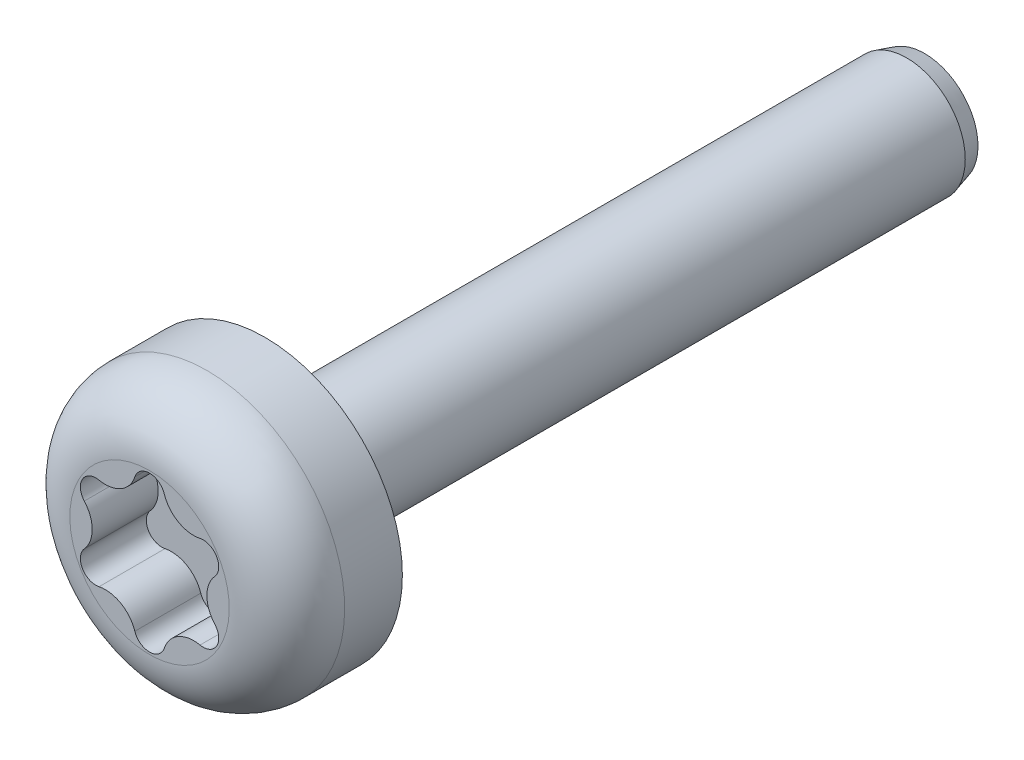
ISO-10303-21;
HEADER;
FILE_DESCRIPTION(('STEP AP214'),'2;1');
FILE_NAME('part.step','',(''),(''),'','','');
FILE_SCHEMA(('AUTOMOTIVE_DESIGN { 1 0 10303 214 1 1 1 1 }'));
ENDSEC;
DATA;
#1=APPLICATION_CONTEXT('core data for automotive mechanical design processes');
#2=APPLICATION_PROTOCOL_DEFINITION('international standard','automotive_design',2000,#1);
#3=PRODUCT_CONTEXT('',#1,'mechanical');
#4=PRODUCT('Part','Part','',(#3));
#5=PRODUCT_RELATED_PRODUCT_CATEGORY('part','',(#4));
#6=PRODUCT_DEFINITION_FORMATION('','',#4);
#7=PRODUCT_DEFINITION_CONTEXT('part definition',#1,'design');
#8=PRODUCT_DEFINITION('design','',#6,#7);
#9=PRODUCT_DEFINITION_SHAPE('','',#8);
#10=(LENGTH_UNIT() NAMED_UNIT(*) SI_UNIT(.MILLI.,.METRE.));
#11=(NAMED_UNIT(*) PLANE_ANGLE_UNIT() SI_UNIT($,.RADIAN.));
#12=(NAMED_UNIT(*) SI_UNIT($,.STERADIAN.) SOLID_ANGLE_UNIT());
#13=UNCERTAINTY_MEASURE_WITH_UNIT(LENGTH_MEASURE(1.E-05),#10,'distance_accuracy_value','');
#14=(GEOMETRIC_REPRESENTATION_CONTEXT(3) GLOBAL_UNCERTAINTY_ASSIGNED_CONTEXT((#13)) GLOBAL_UNIT_ASSIGNED_CONTEXT((#10,
#11,#12)) REPRESENTATION_CONTEXT('',''));
#15=CARTESIAN_POINT('',(0.,0.,0.));
#16=DIRECTION('',(0.,0.,1.));
#17=DIRECTION('',(1.,0.,0.));
#18=AXIS2_PLACEMENT_3D('',#15,#16,#17);
#19=CARTESIAN_POINT('',(0.,0.,-12.));
#20=DIRECTION('',(0.,0.,1.));
#21=DIRECTION('',(1.,0.,0.));
#22=AXIS2_PLACEMENT_3D('',#19,#20,#21);
#23=CYLINDRICAL_SURFACE('',#22,1.065);
#24=CARTESIAN_POINT('',(0.,0.,0.));
#25=DIRECTION('',(0.,0.,1.));
#26=DIRECTION('',(1.,0.,0.));
#27=AXIS2_PLACEMENT_3D('',#24,#25,#26);
#28=CIRCLE('',#27,1.065);
#29=CARTESIAN_POINT('',(1.065,0.,0.));
#30=VERTEX_POINT('',#29);
#31=EDGE_CURVE('E11',#30,#30,#28,.T.);
#32=ORIENTED_EDGE('',*,*,#31,.F.);
#33=EDGE_LOOP('',(#32));
#34=FACE_BOUND('',#33,.T.);
#35=CARTESIAN_POINT('',(0.,0.,-11.6755924170616));
#36=DIRECTION('',(0.,0.,1.));
#37=DIRECTION('',(1.,0.,0.));
#38=AXIS2_PLACEMENT_3D('',#35,#36,#37);
#39=CIRCLE('',#38,1.065);
#40=CARTESIAN_POINT('',(1.065,0.,-11.6755924170616));
#41=VERTEX_POINT('',#40);
#42=EDGE_CURVE('E45',#41,#41,#39,.F.);
#43=ORIENTED_EDGE('',*,*,#42,.F.);
#44=EDGE_LOOP('',(#43));
#45=FACE_BOUND('',#44,.T.);
#46=ADVANCED_FACE('F41',(#34,#45),#23,.T.);
#47=CARTESIAN_POINT('',(0.,1.065,0.));
#48=DIRECTION('',(0.,0.,-1.));
#49=DIRECTION('',(-1.,0.,0.));
#50=AXIS2_PLACEMENT_3D('',#47,#48,#49);
#51=PLANE('',#50);
#52=ORIENTED_EDGE('',*,*,#31,.T.);
#53=EDGE_LOOP('',(#52));
#54=FACE_BOUND('',#53,.T.);
#55=ADVANCED_FACE('F43',(#54),#51,.F.);
#56=CARTESIAN_POINT('',(0.,0.,-10.15));
#57=DIRECTION('',(0.,0.,1.));
#58=DIRECTION('',(1.,0.,0.));
#59=AXIS2_PLACEMENT_3D('',#56,#57,#58);
#60=CONICAL_SURFACE('',#59,1.5,0.277764136028814);
#61=CARTESIAN_POINT('',(0.,0.,-12.));
#62=DIRECTION('',(0.,0.,1.));
#63=DIRECTION('',(1.,0.,0.));
#64=AXIS2_PLACEMENT_3D('',#61,#62,#63);
#65=CIRCLE('',#64,0.9725);
#66=CARTESIAN_POINT('',(0.9725,0.,-12.));
#67=VERTEX_POINT('',#66);
#68=EDGE_CURVE('E52',#67,#67,#65,.T.);
#69=ORIENTED_EDGE('',*,*,#68,.T.);
#70=EDGE_LOOP('',(#69));
#71=FACE_BOUND('',#70,.T.);
#72=ORIENTED_EDGE('',*,*,#42,.T.);
#73=EDGE_LOOP('',(#72));
#74=FACE_BOUND('',#73,.T.);
#75=ADVANCED_FACE('F57',(#71,#74),#60,.T.);
#76=CARTESIAN_POINT('',(0.,0.,-12.));
#77=DIRECTION('',(0.,0.,1.));
#78=DIRECTION('',(1.,0.,0.));
#79=AXIS2_PLACEMENT_3D('',#76,#77,#78);
#80=PLANE('',#79);
#81=ORIENTED_EDGE('',*,*,#68,.F.);
#82=EDGE_LOOP('',(#81));
#83=FACE_BOUND('',#82,.T.);
#84=ADVANCED_FACE('F60',(#83),#80,.F.);
#85=CLOSED_SHELL('',(#46,#55,#75,#84));
#86=MANIFOLD_SOLID_BREP('B2',#85);
#87=CARTESIAN_POINT('',(0.,0.,2.1));
#88=DIRECTION('',(0.,0.,-1.));
#89=DIRECTION('',(-1.,0.,0.));
#90=AXIS2_PLACEMENT_3D('',#87,#88,#89);
#91=CYLINDRICAL_SURFACE('',#90,2.5);
#92=CARTESIAN_POINT('',(0.,0.,1.05));
#93=DIRECTION('',(0.,0.,-1.));
#94=DIRECTION('',(0.,1.,0.));
#95=AXIS2_PLACEMENT_3D('',#92,#93,#94);
#96=CIRCLE('',#95,2.5);
#97=CARTESIAN_POINT('',(0.,2.5,1.05));
#98=VERTEX_POINT('',#97);
#99=EDGE_CURVE('E192',#98,#98,#96,.T.);
#100=ORIENTED_EDGE('',*,*,#99,.T.);
#101=EDGE_LOOP('',(#100));
#102=FACE_BOUND('',#101,.T.);
#103=CARTESIAN_POINT('',(0.,0.,0.));
#104=DIRECTION('',(0.,0.,1.));
#105=DIRECTION('',(1.,0.,0.));
#106=AXIS2_PLACEMENT_3D('',#103,#104,#105);
#107=CIRCLE('',#106,2.5);
#108=CARTESIAN_POINT('',(2.5,0.,0.));
#109=VERTEX_POINT('',#108);
#110=EDGE_CURVE('E39',#109,#109,#107,.T.);
#111=ORIENTED_EDGE('',*,*,#110,.T.);
#112=EDGE_LOOP('',(#111));
#113=FACE_BOUND('',#112,.T.);
#114=ADVANCED_FACE('F97',(#102,#113),#91,.T.);
#115=CARTESIAN_POINT('',(0.,0.,0.));
#116=DIRECTION('',(0.,0.,1.));
#117=DIRECTION('',(1.,0.,0.));
#118=AXIS2_PLACEMENT_3D('',#115,#116,#117);
#119=PLANE('',#118);
#120=ORIENTED_EDGE('',*,*,#110,.F.);
#121=EDGE_LOOP('',(#120));
#122=FACE_BOUND('',#121,.T.);
#123=ADVANCED_FACE('F209',(#122),#119,.F.);
#124=CARTESIAN_POINT('',(0.,0.,1.05));
#125=DIRECTION('',(0.,0.,-1.));
#126=DIRECTION('',(0.,1.,0.));
#127=AXIS2_PLACEMENT_3D('',#124,#125,#126);
#128=TOROIDAL_SURFACE('',#127,1.45,1.05);
#129=ORIENTED_EDGE('',*,*,#99,.F.);
#130=EDGE_LOOP('',(#129));
#131=FACE_BOUND('',#130,.T.);
#132=CARTESIAN_POINT('',(0.,0.,2.1));
#133=DIRECTION('',(0.,0.,-1.));
#134=DIRECTION('',(0.,1.,0.));
#135=AXIS2_PLACEMENT_3D('',#132,#133,#134);
#136=CIRCLE('',#135,1.45);
#137=CARTESIAN_POINT('',(0.,1.45,2.1));
#138=VERTEX_POINT('',#137);
#139=EDGE_CURVE('E105',#138,#138,#136,.T.);
#140=ORIENTED_EDGE('',*,*,#139,.T.);
#141=EDGE_LOOP('',(#140));
#142=FACE_BOUND('',#141,.T.);
#143=ADVANCED_FACE('F198',(#131,#142),#128,.T.);
#144=CARTESIAN_POINT('',(0.,0.,2.1));
#145=DIRECTION('',(0.,0.,1.));
#146=DIRECTION('',(1.,0.,0.));
#147=AXIS2_PLACEMENT_3D('',#144,#145,#146);
#148=PLANE('',#147);
#149=CARTESIAN_POINT('',(-0.976530245307334,0.563799999999998,2.1));
#150=DIRECTION('',(0.,0.,1.));
#151=DIRECTION('',(-0.499999999999998,-0.86602540378444,0.));
#152=AXIS2_PLACEMENT_3D('',#149,#150,#151);
#153=CIRCLE('',#152,0.2819);
#154=CARTESIAN_POINT('',(-0.918833131565646,0.839732334215977,2.1));
#155=VERTEX_POINT('',#154);
#156=CARTESIAN_POINT('',(-1.18664609959307,0.375866666666665,2.1));
#157=VERTEX_POINT('',#156);
#158=EDGE_CURVE('E156',#155,#157,#153,.T.);
#159=ORIENTED_EDGE('',*,*,#158,.F.);
#160=CARTESIAN_POINT('',(-0.80343890408226,1.39159700264794,2.1));
#161=DIRECTION('',(0.,0.,-1.));
#162=DIRECTION('',(1.,0.,0.));
#163=AXIS2_PLACEMENT_3D('',#160,#161,#162);
#164=CIRCLE('',#163,0.5638);
#165=CARTESIAN_POINT('',(-0.26781296802742,1.21559900088265,2.1));
#166=VERTEX_POINT('',#165);
#167=EDGE_CURVE('E151',#166,#155,#164,.T.);
#168=ORIENTED_EDGE('',*,*,#167,.F.);
#169=CARTESIAN_POINT('',(0.,1.1276,2.1));
#170=DIRECTION('',(0.,0.,1.));
#171=DIRECTION('',(-1.,0.,0.));
#172=AXIS2_PLACEMENT_3D('',#169,#170,#171);
#173=CIRCLE('',#172,0.2819);
#174=CARTESIAN_POINT('',(0.26781296802742,1.21559900088265,2.1));
#175=VERTEX_POINT('',#174);
#176=EDGE_CURVE('E181',#175,#166,#173,.T.);
#177=ORIENTED_EDGE('',*,*,#176,.F.);
#178=CARTESIAN_POINT('',(0.80343890408226,1.39159700264794,2.1));
#179=DIRECTION('',(0.,0.,-1.));
#180=DIRECTION('',(1.,0.,0.));
#181=AXIS2_PLACEMENT_3D('',#178,#179,#180);
#182=CIRCLE('',#181,0.5638);
#183=CARTESIAN_POINT('',(0.918833131565634,0.839732334215989,2.1));
#184=VERTEX_POINT('',#183);
#185=EDGE_CURVE('E188',#184,#175,#182,.T.);
#186=ORIENTED_EDGE('',*,*,#185,.F.);
#187=CARTESIAN_POINT('',(0.976530245307326,0.563800000000011,2.1));
#188=DIRECTION('',(0.,0.,1.));
#189=DIRECTION('',(-0.50000000000001,0.866025403784433,0.));
#190=AXIS2_PLACEMENT_3D('',#187,#188,#189);
#191=CIRCLE('',#190,0.2819);
#192=CARTESIAN_POINT('',(1.18664609959306,0.375866666666681,2.1));
#193=VERTEX_POINT('',#192);
#194=EDGE_CURVE('E369',#193,#184,#191,.T.);
#195=ORIENTED_EDGE('',*,*,#194,.F.);
#196=CARTESIAN_POINT('',(1.60687780816453,0.,2.1));
#197=DIRECTION('',(0.,0.,-1.));
#198=DIRECTION('',(-0.499999999999992,-0.866025403784443,0.));
#199=AXIS2_PLACEMENT_3D('',#196,#197,#198);
#200=CIRCLE('',#199,0.5638);
#201=CARTESIAN_POINT('',(1.18664609959307,-0.375866666666657,2.1));
#202=VERTEX_POINT('',#201);
#203=EDGE_CURVE('E387',#202,#193,#200,.T.);
#204=ORIENTED_EDGE('',*,*,#203,.F.);
#205=CARTESIAN_POINT('',(0.976530245307338,-0.563799999999991,2.1));
#206=DIRECTION('',(0.,0.,1.));
#207=DIRECTION('',(0.499999999999992,0.866025403784443,0.));
#208=AXIS2_PLACEMENT_3D('',#205,#206,#207);
#209=CIRCLE('',#208,0.2819);
#210=CARTESIAN_POINT('',(0.918833131565652,-0.839732334215971,2.1));
#211=VERTEX_POINT('',#210);
#212=EDGE_CURVE('E393',#211,#202,#209,.T.);
#213=ORIENTED_EDGE('',*,*,#212,.F.);
#214=CARTESIAN_POINT('',(0.80343890408227,-1.39159700264794,2.1));
#215=DIRECTION('',(0.,0.,-1.));
#216=DIRECTION('',(-1.,0.,0.));
#217=AXIS2_PLACEMENT_3D('',#214,#215,#216);
#218=CIRCLE('',#217,0.5638);
#219=CARTESIAN_POINT('',(0.267812968027429,-1.21559900088265,2.1));
#220=VERTEX_POINT('',#219);
#221=EDGE_CURVE('E404',#220,#211,#218,.T.);
#222=ORIENTED_EDGE('',*,*,#221,.F.);
#223=CARTESIAN_POINT('',(0.,-1.1276,2.1));
#224=DIRECTION('',(0.,0.,1.));
#225=DIRECTION('',(1.,0.,0.));
#226=AXIS2_PLACEMENT_3D('',#223,#224,#225);
#227=CIRCLE('',#226,0.2819);
#228=CARTESIAN_POINT('',(-0.267812968027412,-1.21559900088265,2.1));
#229=VERTEX_POINT('',#228);
#230=EDGE_CURVE('E411',#229,#220,#227,.T.);
#231=ORIENTED_EDGE('',*,*,#230,.F.);
#232=CARTESIAN_POINT('',(-0.803438904082261,-1.39159700264794,2.1));
#233=DIRECTION('',(0.,0.,-1.));
#234=DIRECTION('',(-0.500000000000004,0.866025403784436,0.));
#235=AXIS2_PLACEMENT_3D('',#232,#233,#234);
#236=CIRCLE('',#235,0.5638);
#237=CARTESIAN_POINT('',(-0.918833131565641,-0.839732334215984,2.1));
#238=VERTEX_POINT('',#237);
#239=EDGE_CURVE('E422',#238,#229,#236,.T.);
#240=ORIENTED_EDGE('',*,*,#239,.F.);
#241=CARTESIAN_POINT('',(-0.976530245307331,-0.563800000000005,2.1));
#242=DIRECTION('',(0.,0.,1.));
#243=DIRECTION('',(0.500000000000004,-0.866025403784436,0.));
#244=AXIS2_PLACEMENT_3D('',#241,#242,#243);
#245=CIRCLE('',#244,0.2819);
#246=CARTESIAN_POINT('',(-1.18664609959306,-0.375866666666674,2.1));
#247=VERTEX_POINT('',#246);
#248=EDGE_CURVE('E167',#247,#238,#245,.T.);
#249=ORIENTED_EDGE('',*,*,#248,.F.);
#250=CARTESIAN_POINT('',(-1.60687780816453,0.,2.1));
#251=DIRECTION('',(0.,0.,-1.));
#252=DIRECTION('',(0.499999999999998,0.86602540378444,0.));
#253=AXIS2_PLACEMENT_3D('',#250,#251,#252);
#254=CIRCLE('',#253,0.5638);
#255=EDGE_CURVE('E146',#157,#247,#254,.T.);
#256=ORIENTED_EDGE('',*,*,#255,.F.);
#257=EDGE_LOOP('',(#159,#168,#177,#186,#195,#204,#213,#222,#231,#240,#249,#256));
#258=FACE_BOUND('',#257,.T.);
#259=ORIENTED_EDGE('',*,*,#139,.F.);
#260=EDGE_LOOP('',(#259));
#261=FACE_BOUND('',#260,.T.);
#262=ADVANCED_FACE('F163',(#258,#261),#148,.T.);
#263=CARTESIAN_POINT('',(-0.80343890408226,1.39159700264794,0.9));
#264=DIRECTION('',(0.,0.,1.));
#265=DIRECTION('',(1.,0.,0.));
#266=AXIS2_PLACEMENT_3D('',#263,#264,#265);
#267=CYLINDRICAL_SURFACE('',#266,0.5638);
#268=ORIENTED_EDGE('',*,*,#167,.T.);
#269=DIRECTION('',(0.,0.,1.));
#270=VECTOR('',#269,1.);
#271=CARTESIAN_POINT('',(-0.918833131565646,0.839732334215977,0.9));
#272=LINE('',#271,#270);
#273=CARTESIAN_POINT('',(-0.918833131565646,0.839732334215977,0.9));
#274=VERTEX_POINT('',#273);
#275=EDGE_CURVE('E152',#274,#155,#272,.T.);
#276=ORIENTED_EDGE('',*,*,#275,.F.);
#277=CARTESIAN_POINT('',(-0.80343890408226,1.39159700264794,0.9));
#278=DIRECTION('',(0.,0.,-1.));
#279=DIRECTION('',(1.,0.,0.));
#280=AXIS2_PLACEMENT_3D('',#277,#278,#279);
#281=CIRCLE('',#280,0.5638);
#282=CARTESIAN_POINT('',(-0.26781296802742,1.21559900088265,0.9));
#283=VERTEX_POINT('',#282);
#284=EDGE_CURVE('E178',#283,#274,#281,.T.);
#285=ORIENTED_EDGE('',*,*,#284,.F.);
#286=DIRECTION('',(0.,0.,1.));
#287=VECTOR('',#286,1.);
#288=CARTESIAN_POINT('',(-0.26781296802742,1.21559900088265,0.9));
#289=LINE('',#288,#287);
#290=EDGE_CURVE('E113',#283,#166,#289,.T.);
#291=ORIENTED_EDGE('',*,*,#290,.T.);
#292=EDGE_LOOP('',(#268,#276,#285,#291));
#293=FACE_BOUND('',#292,.T.);
#294=ADVANCED_FACE('F200',(#293),#267,.T.);
#295=CARTESIAN_POINT('',(0.,1.1276,0.9));
#296=DIRECTION('',(0.,0.,1.));
#297=DIRECTION('',(1.,0.,0.));
#298=AXIS2_PLACEMENT_3D('',#295,#296,#297);
#299=CYLINDRICAL_SURFACE('',#298,0.2819);
#300=ORIENTED_EDGE('',*,*,#176,.T.);
#301=ORIENTED_EDGE('',*,*,#290,.F.);
#302=CARTESIAN_POINT('',(0.,1.1276,0.9));
#303=DIRECTION('',(0.,0.,1.));
#304=DIRECTION('',(-1.,0.,0.));
#305=AXIS2_PLACEMENT_3D('',#302,#303,#304);
#306=CIRCLE('',#305,0.2819);
#307=CARTESIAN_POINT('',(0.26781296802742,1.21559900088265,0.9));
#308=VERTEX_POINT('',#307);
#309=EDGE_CURVE('E184',#308,#283,#306,.T.);
#310=ORIENTED_EDGE('',*,*,#309,.F.);
#311=DIRECTION('',(0.,0.,1.));
#312=VECTOR('',#311,1.);
#313=CARTESIAN_POINT('',(0.26781296802742,1.21559900088265,0.9));
#314=LINE('',#313,#312);
#315=EDGE_CURVE('E121',#308,#175,#314,.T.);
#316=ORIENTED_EDGE('',*,*,#315,.T.);
#317=EDGE_LOOP('',(#300,#301,#310,#316));
#318=FACE_BOUND('',#317,.T.);
#319=ADVANCED_FACE('F206',(#318),#299,.F.);
#320=CARTESIAN_POINT('',(0.80343890408226,1.39159700264794,0.9));
#321=DIRECTION('',(0.,0.,1.));
#322=DIRECTION('',(1.,0.,0.));
#323=AXIS2_PLACEMENT_3D('',#320,#321,#322);
#324=CYLINDRICAL_SURFACE('',#323,0.5638);
#325=ORIENTED_EDGE('',*,*,#185,.T.);
#326=ORIENTED_EDGE('',*,*,#315,.F.);
#327=CARTESIAN_POINT('',(0.80343890408226,1.39159700264794,0.9));
#328=DIRECTION('',(0.,0.,-1.));
#329=DIRECTION('',(1.,0.,0.));
#330=AXIS2_PLACEMENT_3D('',#327,#328,#329);
#331=CIRCLE('',#330,0.5638);
#332=CARTESIAN_POINT('',(0.918833131565634,0.839732334215989,0.9));
#333=VERTEX_POINT('',#332);
#334=EDGE_CURVE('E180',#333,#308,#331,.T.);
#335=ORIENTED_EDGE('',*,*,#334,.F.);
#336=DIRECTION('',(0.,0.,1.));
#337=VECTOR('',#336,1.);
#338=CARTESIAN_POINT('',(0.918833131565634,0.839732334215989,0.9));
#339=LINE('',#338,#337);
#340=EDGE_CURVE('E373',#333,#184,#339,.T.);
#341=ORIENTED_EDGE('',*,*,#340,.T.);
#342=EDGE_LOOP('',(#325,#326,#335,#341));
#343=FACE_BOUND('',#342,.T.);
#344=ADVANCED_FACE('F238',(#343),#324,.T.);
#345=CARTESIAN_POINT('',(-0.80343890408226,1.39159700264794,0.9));
#346=DIRECTION('',(0.,0.,1.));
#347=DIRECTION('',(1.,0.,0.));
#348=AXIS2_PLACEMENT_3D('',#345,#346,#347);
#349=PLANE('',#348);
#350=ORIENTED_EDGE('',*,*,#284,.T.);
#351=CARTESIAN_POINT('',(-0.976530245307334,0.563799999999998,0.9));
#352=DIRECTION('',(0.,0.,1.));
#353=DIRECTION('',(-0.499999999999998,-0.86602540378444,0.));
#354=AXIS2_PLACEMENT_3D('',#351,#352,#353);
#355=CIRCLE('',#354,0.2819);
#356=CARTESIAN_POINT('',(-1.18664609959306,0.375866666666665,0.9));
#357=VERTEX_POINT('',#356);
#358=EDGE_CURVE('E174',#274,#357,#355,.T.);
#359=ORIENTED_EDGE('',*,*,#358,.T.);
#360=CARTESIAN_POINT('',(-1.60687780816453,0.,0.9));
#361=DIRECTION('',(0.,0.,-1.));
#362=DIRECTION('',(0.499999999999998,0.86602540378444,0.));
#363=AXIS2_PLACEMENT_3D('',#360,#361,#362);
#364=CIRCLE('',#363,0.5638);
#365=CARTESIAN_POINT('',(-1.18664609959306,-0.375866666666674,0.9));
#366=VERTEX_POINT('',#365);
#367=EDGE_CURVE('E149',#357,#366,#364,.T.);
#368=ORIENTED_EDGE('',*,*,#367,.T.);
#369=CARTESIAN_POINT('',(-0.976530245307331,-0.563800000000005,0.9));
#370=DIRECTION('',(0.,0.,1.));
#371=DIRECTION('',(0.500000000000004,-0.866025403784436,0.));
#372=AXIS2_PLACEMENT_3D('',#369,#370,#371);
#373=CIRCLE('',#372,0.2819);
#374=CARTESIAN_POINT('',(-0.918833131565641,-0.839732334215983,0.9));
#375=VERTEX_POINT('',#374);
#376=EDGE_CURVE('E428',#366,#375,#373,.T.);
#377=ORIENTED_EDGE('',*,*,#376,.T.);
#378=CARTESIAN_POINT('',(-0.80343890408226,-1.39159700264794,0.9));
#379=DIRECTION('',(0.,0.,-1.));
#380=DIRECTION('',(-0.500000000000004,0.866025403784436,0.));
#381=AXIS2_PLACEMENT_3D('',#378,#379,#380);
#382=CIRCLE('',#381,0.5638);
#383=CARTESIAN_POINT('',(-0.267812968027412,-1.21559900088265,0.9));
#384=VERTEX_POINT('',#383);
#385=EDGE_CURVE('E425',#375,#384,#382,.T.);
#386=ORIENTED_EDGE('',*,*,#385,.T.);
#387=CARTESIAN_POINT('',(0.,-1.1276,0.9));
#388=DIRECTION('',(0.,0.,1.));
#389=DIRECTION('',(1.,0.,0.));
#390=AXIS2_PLACEMENT_3D('',#387,#388,#389);
#391=CIRCLE('',#390,0.2819);
#392=CARTESIAN_POINT('',(0.267812968027429,-1.21559900088264,0.9));
#393=VERTEX_POINT('',#392);
#394=EDGE_CURVE('E410',#384,#393,#391,.T.);
#395=ORIENTED_EDGE('',*,*,#394,.T.);
#396=CARTESIAN_POINT('',(0.80343890408227,-1.39159700264793,0.9));
#397=DIRECTION('',(0.,0.,-1.));
#398=DIRECTION('',(-1.,0.,0.));
#399=AXIS2_PLACEMENT_3D('',#396,#397,#398);
#400=CIRCLE('',#399,0.5638);
#401=CARTESIAN_POINT('',(0.918833131565652,-0.839732334215971,0.9));
#402=VERTEX_POINT('',#401);
#403=EDGE_CURVE('E407',#393,#402,#400,.T.);
#404=ORIENTED_EDGE('',*,*,#403,.T.);
#405=CARTESIAN_POINT('',(0.976530245307338,-0.563799999999991,0.9));
#406=DIRECTION('',(0.,0.,1.));
#407=DIRECTION('',(0.499999999999992,0.866025403784443,0.));
#408=AXIS2_PLACEMENT_3D('',#405,#406,#407);
#409=CIRCLE('',#408,0.2819);
#410=CARTESIAN_POINT('',(1.18664609959307,-0.375866666666657,0.9));
#411=VERTEX_POINT('',#410);
#412=EDGE_CURVE('E392',#402,#411,#409,.T.);
#413=ORIENTED_EDGE('',*,*,#412,.T.);
#414=CARTESIAN_POINT('',(1.60687780816453,0.,0.9));
#415=DIRECTION('',(0.,0.,-1.));
#416=DIRECTION('',(-0.499999999999992,-0.866025403784443,0.));
#417=AXIS2_PLACEMENT_3D('',#414,#415,#416);
#418=CIRCLE('',#417,0.5638);
#419=CARTESIAN_POINT('',(1.18664609959306,0.375866666666682,0.9));
#420=VERTEX_POINT('',#419);
#421=EDGE_CURVE('E389',#411,#420,#418,.T.);
#422=ORIENTED_EDGE('',*,*,#421,.T.);
#423=CARTESIAN_POINT('',(0.976530245307326,0.563800000000011,0.9));
#424=DIRECTION('',(0.,0.,1.));
#425=DIRECTION('',(-0.50000000000001,0.866025403784433,0.));
#426=AXIS2_PLACEMENT_3D('',#423,#424,#425);
#427=CIRCLE('',#426,0.2819);
#428=EDGE_CURVE('E382',#420,#333,#427,.T.);
#429=ORIENTED_EDGE('',*,*,#428,.T.);
#430=ORIENTED_EDGE('',*,*,#334,.T.);
#431=ORIENTED_EDGE('',*,*,#309,.T.);
#432=EDGE_LOOP('',(#350,#359,#368,#377,#386,#395,#404,#413,#422,#429,#430,#431));
#433=FACE_BOUND('',#432,.T.);
#434=ADVANCED_FACE('F260',(#433),#349,.T.);
#435=CARTESIAN_POINT('',(-1.60687780816453,0.,0.9));
#436=DIRECTION('',(0.,0.,1.));
#437=DIRECTION('',(1.,0.,0.));
#438=AXIS2_PLACEMENT_3D('',#435,#436,#437);
#439=CYLINDRICAL_SURFACE('',#438,0.5638);
#440=ORIENTED_EDGE('',*,*,#255,.T.);
#441=DIRECTION('',(0.,0.,1.));
#442=VECTOR('',#441,1.);
#443=CARTESIAN_POINT('',(-1.18664609959306,-0.375866666666674,0.9));
#444=LINE('',#443,#442);
#445=EDGE_CURVE('E171',#366,#247,#444,.T.);
#446=ORIENTED_EDGE('',*,*,#445,.F.);
#447=ORIENTED_EDGE('',*,*,#367,.F.);
#448=DIRECTION('',(0.,0.,1.));
#449=VECTOR('',#448,1.);
#450=CARTESIAN_POINT('',(-1.18664609959306,0.375866666666665,0.9));
#451=LINE('',#450,#449);
#452=EDGE_CURVE('E130',#357,#157,#451,.T.);
#453=ORIENTED_EDGE('',*,*,#452,.T.);
#454=EDGE_LOOP('',(#440,#446,#447,#453));
#455=FACE_BOUND('',#454,.T.);
#456=ADVANCED_FACE('F142',(#455),#439,.T.);
#457=CARTESIAN_POINT('',(-0.976530245307334,0.563799999999998,0.9));
#458=DIRECTION('',(0.,0.,1.));
#459=DIRECTION('',(1.,0.,0.));
#460=AXIS2_PLACEMENT_3D('',#457,#458,#459);
#461=CYLINDRICAL_SURFACE('',#460,0.2819);
#462=ORIENTED_EDGE('',*,*,#158,.T.);
#463=ORIENTED_EDGE('',*,*,#452,.F.);
#464=ORIENTED_EDGE('',*,*,#358,.F.);
#465=ORIENTED_EDGE('',*,*,#275,.T.);
#466=EDGE_LOOP('',(#462,#463,#464,#465));
#467=FACE_BOUND('',#466,.T.);
#468=ADVANCED_FACE('F157',(#467),#461,.F.);
#469=CARTESIAN_POINT('',(-0.80343890408226,-1.39159700264794,0.9));
#470=DIRECTION('',(0.,0.,1.));
#471=DIRECTION('',(0.,-1.,0.));
#472=AXIS2_PLACEMENT_3D('',#469,#470,#471);
#473=CYLINDRICAL_SURFACE('',#472,0.5638);
#474=ORIENTED_EDGE('',*,*,#239,.T.);
#475=DIRECTION('',(0.,0.,1.));
#476=VECTOR('',#475,1.);
#477=CARTESIAN_POINT('',(-0.267812968027412,-1.21559900088265,0.9));
#478=LINE('',#477,#476);
#479=EDGE_CURVE('E414',#384,#229,#478,.T.);
#480=ORIENTED_EDGE('',*,*,#479,.F.);
#481=ORIENTED_EDGE('',*,*,#385,.F.);
#482=DIRECTION('',(0.,0.,1.));
#483=VECTOR('',#482,1.);
#484=CARTESIAN_POINT('',(-0.918833131565641,-0.839732334215983,0.9));
#485=LINE('',#484,#483);
#486=EDGE_CURVE('E168',#375,#238,#485,.T.);
#487=ORIENTED_EDGE('',*,*,#486,.T.);
#488=EDGE_LOOP('',(#474,#480,#481,#487));
#489=FACE_BOUND('',#488,.T.);
#490=ADVANCED_FACE('F288',(#489),#473,.T.);
#491=CARTESIAN_POINT('',(-0.976530245307331,-0.563800000000005,0.9));
#492=DIRECTION('',(0.,0.,1.));
#493=DIRECTION('',(0.,-1.,0.));
#494=AXIS2_PLACEMENT_3D('',#491,#492,#493);
#495=CYLINDRICAL_SURFACE('',#494,0.2819);
#496=ORIENTED_EDGE('',*,*,#248,.T.);
#497=ORIENTED_EDGE('',*,*,#486,.F.);
#498=ORIENTED_EDGE('',*,*,#376,.F.);
#499=ORIENTED_EDGE('',*,*,#445,.T.);
#500=EDGE_LOOP('',(#496,#497,#498,#499));
#501=FACE_BOUND('',#500,.T.);
#502=ADVANCED_FACE('F298',(#501),#495,.F.);
#503=CARTESIAN_POINT('',(0.80343890408227,-1.39159700264793,0.9));
#504=DIRECTION('',(0.,0.,1.));
#505=DIRECTION('',(0.,-1.,0.));
#506=AXIS2_PLACEMENT_3D('',#503,#504,#505);
#507=CYLINDRICAL_SURFACE('',#506,0.5638);
#508=ORIENTED_EDGE('',*,*,#221,.T.);
#509=DIRECTION('',(0.,0.,1.));
#510=VECTOR('',#509,1.);
#511=CARTESIAN_POINT('',(0.918833131565652,-0.839732334215971,0.9));
#512=LINE('',#511,#510);
#513=EDGE_CURVE('E396',#402,#211,#512,.T.);
#514=ORIENTED_EDGE('',*,*,#513,.F.);
#515=ORIENTED_EDGE('',*,*,#403,.F.);
#516=DIRECTION('',(0.,0.,1.));
#517=VECTOR('',#516,1.);
#518=CARTESIAN_POINT('',(0.267812968027429,-1.21559900088264,0.9));
#519=LINE('',#518,#517);
#520=EDGE_CURVE('E419',#393,#220,#519,.T.);
#521=ORIENTED_EDGE('',*,*,#520,.T.);
#522=EDGE_LOOP('',(#508,#514,#515,#521));
#523=FACE_BOUND('',#522,.T.);
#524=ADVANCED_FACE('F308',(#523),#507,.T.);
#525=CARTESIAN_POINT('',(0.,-1.1276,0.9));
#526=DIRECTION('',(0.,0.,1.));
#527=DIRECTION('',(0.,-1.,0.));
#528=AXIS2_PLACEMENT_3D('',#525,#526,#527);
#529=CYLINDRICAL_SURFACE('',#528,0.2819);
#530=ORIENTED_EDGE('',*,*,#230,.T.);
#531=ORIENTED_EDGE('',*,*,#520,.F.);
#532=ORIENTED_EDGE('',*,*,#394,.F.);
#533=ORIENTED_EDGE('',*,*,#479,.T.);
#534=EDGE_LOOP('',(#530,#531,#532,#533));
#535=FACE_BOUND('',#534,.T.);
#536=ADVANCED_FACE('F319',(#535),#529,.F.);
#537=CARTESIAN_POINT('',(1.60687780816453,0.,0.9));
#538=DIRECTION('',(0.,0.,1.));
#539=DIRECTION('',(0.,-1.,0.));
#540=AXIS2_PLACEMENT_3D('',#537,#538,#539);
#541=CYLINDRICAL_SURFACE('',#540,0.5638);
#542=ORIENTED_EDGE('',*,*,#203,.T.);
#543=DIRECTION('',(0.,0.,1.));
#544=VECTOR('',#543,1.);
#545=CARTESIAN_POINT('',(1.18664609959306,0.375866666666682,0.9));
#546=LINE('',#545,#544);
#547=EDGE_CURVE('E377',#420,#193,#546,.T.);
#548=ORIENTED_EDGE('',*,*,#547,.F.);
#549=ORIENTED_EDGE('',*,*,#421,.F.);
#550=DIRECTION('',(0.,0.,1.));
#551=VECTOR('',#550,1.);
#552=CARTESIAN_POINT('',(1.18664609959307,-0.375866666666657,0.9));
#553=LINE('',#552,#551);
#554=EDGE_CURVE('E401',#411,#202,#553,.T.);
#555=ORIENTED_EDGE('',*,*,#554,.T.);
#556=EDGE_LOOP('',(#542,#548,#549,#555));
#557=FACE_BOUND('',#556,.T.);
#558=ADVANCED_FACE('F329',(#557),#541,.T.);
#559=CARTESIAN_POINT('',(0.976530245307338,-0.563799999999991,0.9));
#560=DIRECTION('',(0.,0.,1.));
#561=DIRECTION('',(0.,-1.,0.));
#562=AXIS2_PLACEMENT_3D('',#559,#560,#561);
#563=CYLINDRICAL_SURFACE('',#562,0.2819);
#564=ORIENTED_EDGE('',*,*,#212,.T.);
#565=ORIENTED_EDGE('',*,*,#554,.F.);
#566=ORIENTED_EDGE('',*,*,#412,.F.);
#567=ORIENTED_EDGE('',*,*,#513,.T.);
#568=EDGE_LOOP('',(#564,#565,#566,#567));
#569=FACE_BOUND('',#568,.T.);
#570=ADVANCED_FACE('F340',(#569),#563,.F.);
#571=CARTESIAN_POINT('',(0.976530245307326,0.563800000000011,0.9));
#572=DIRECTION('',(0.,0.,1.));
#573=DIRECTION('',(1.,0.,0.));
#574=AXIS2_PLACEMENT_3D('',#571,#572,#573);
#575=CYLINDRICAL_SURFACE('',#574,0.2819);
#576=ORIENTED_EDGE('',*,*,#194,.T.);
#577=ORIENTED_EDGE('',*,*,#340,.F.);
#578=ORIENTED_EDGE('',*,*,#428,.F.);
#579=ORIENTED_EDGE('',*,*,#547,.T.);
#580=EDGE_LOOP('',(#576,#577,#578,#579));
#581=FACE_BOUND('',#580,.T.);
#582=ADVANCED_FACE('F350',(#581),#575,.F.);
#583=CLOSED_SHELL('',(#114,#123,#143,#262,#294,#319,#344,#434,#456,#468,#490,#502,#524,#536,
#558,#570,#582));
#584=MANIFOLD_SOLID_BREP('B6',#583);
#585=ADVANCED_BREP_SHAPE_REPRESENTATION('',(#18,#86,#584),#14);
#586=SHAPE_DEFINITION_REPRESENTATION(#9,#585);
ENDSEC;
END-ISO-10303-21;
